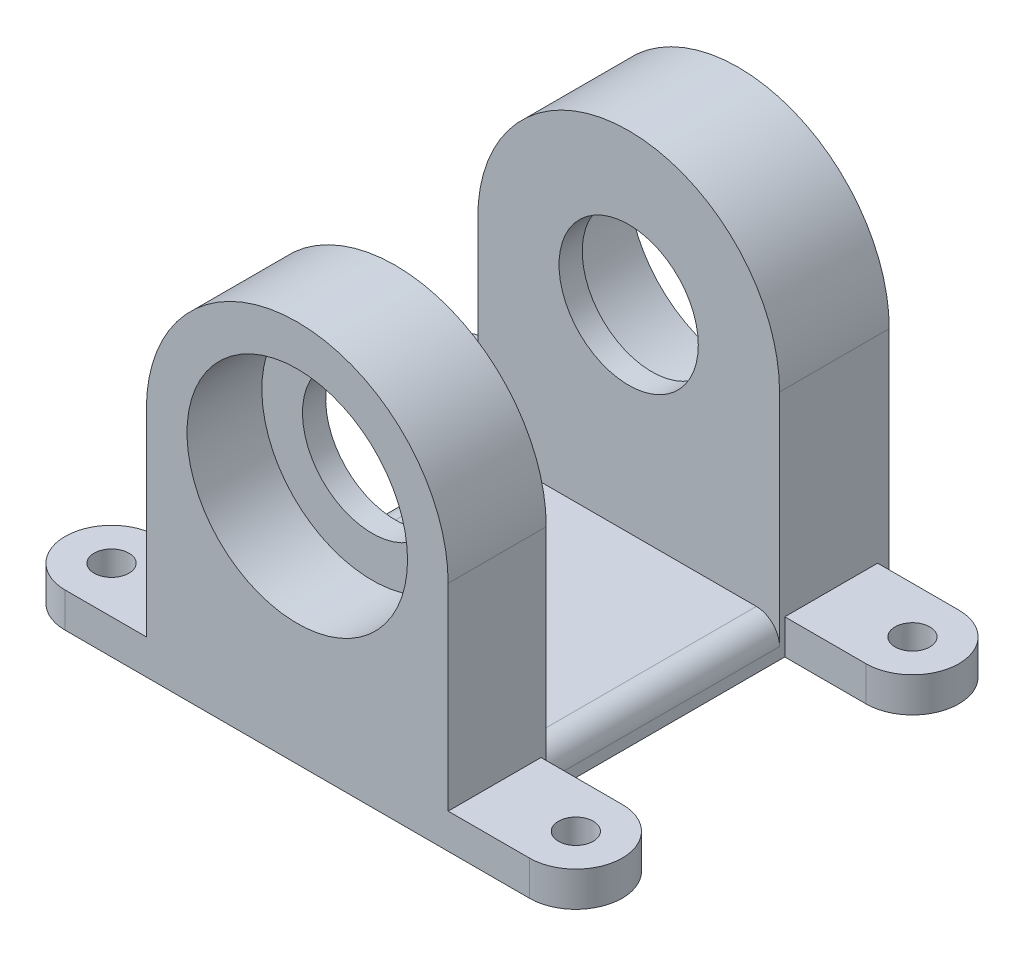
ISO-10303-21;
HEADER;
FILE_DESCRIPTION(('STEP AP214'),'2;1');
FILE_NAME('part.step','',(''),(''),'','','');
FILE_SCHEMA(('AUTOMOTIVE_DESIGN { 1 0 10303 214 1 1 1 1 }'));
ENDSEC;
DATA;
#1=APPLICATION_CONTEXT('core data for automotive mechanical design processes');
#2=APPLICATION_PROTOCOL_DEFINITION('international standard','automotive_design',2000,#1);
#3=PRODUCT_CONTEXT('',#1,'mechanical');
#4=PRODUCT('Part','Part','',(#3));
#5=PRODUCT_RELATED_PRODUCT_CATEGORY('part','',(#4));
#6=PRODUCT_DEFINITION_FORMATION('','',#4);
#7=PRODUCT_DEFINITION_CONTEXT('part definition',#1,'design');
#8=PRODUCT_DEFINITION('design','',#6,#7);
#9=PRODUCT_DEFINITION_SHAPE('','',#8);
#10=(LENGTH_UNIT() NAMED_UNIT(*) SI_UNIT(.MILLI.,.METRE.));
#11=(NAMED_UNIT(*) PLANE_ANGLE_UNIT() SI_UNIT($,.RADIAN.));
#12=(NAMED_UNIT(*) SI_UNIT($,.STERADIAN.) SOLID_ANGLE_UNIT());
#13=UNCERTAINTY_MEASURE_WITH_UNIT(LENGTH_MEASURE(1.E-05),#10,'distance_accuracy_value','');
#14=(GEOMETRIC_REPRESENTATION_CONTEXT(3) GLOBAL_UNCERTAINTY_ASSIGNED_CONTEXT((#13)) GLOBAL_UNIT_ASSIGNED_CONTEXT((#10,
#11,#12)) REPRESENTATION_CONTEXT('',''));
#15=CARTESIAN_POINT('',(0.,0.,0.));
#16=DIRECTION('',(0.,0.,1.));
#17=DIRECTION('',(1.,0.,0.));
#18=AXIS2_PLACEMENT_3D('',#15,#16,#17);
#19=CARTESIAN_POINT('',(0.,0.,0.));
#20=DIRECTION('',(0.,0.,1.));
#21=DIRECTION('',(1.,0.,0.));
#22=AXIS2_PLACEMENT_3D('',#19,#20,#21);
#23=PLANE('',#22);
#24=DIRECTION('',(0.,1.,0.));
#25=VECTOR('',#24,1.);
#26=CARTESIAN_POINT('',(-13.,0.,0.));
#27=LINE('',#26,#25);
#28=CARTESIAN_POINT('',(-13.,-20.,0.));
#29=VERTEX_POINT('',#28);
#30=CARTESIAN_POINT('',(-13.,-17.,0.));
#31=VERTEX_POINT('',#30);
#32=EDGE_CURVE('E474',#29,#31,#27,.T.);
#33=ORIENTED_EDGE('',*,*,#32,.F.);
#34=DIRECTION('',(1.,0.,0.));
#35=VECTOR('',#34,1.);
#36=CARTESIAN_POINT('',(-13.,-20.,0.));
#37=LINE('',#36,#35);
#38=CARTESIAN_POINT('',(-20.,-20.,0.));
#39=VERTEX_POINT('',#38);
#40=EDGE_CURVE('E387',#39,#29,#37,.T.);
#41=ORIENTED_EDGE('',*,*,#40,.F.);
#42=DIRECTION('',(0.,-1.,0.));
#43=VECTOR('',#42,1.);
#44=CARTESIAN_POINT('',(-20.,-17.,0.));
#45=LINE('',#44,#43);
#46=CARTESIAN_POINT('',(-20.,-17.,0.));
#47=VERTEX_POINT('',#46);
#48=EDGE_CURVE('E276',#47,#39,#45,.T.);
#49=ORIENTED_EDGE('',*,*,#48,.F.);
#50=DIRECTION('',(1.,0.,0.));
#51=VECTOR('',#50,1.);
#52=CARTESIAN_POINT('',(-13.,-17.,0.));
#53=LINE('',#52,#51);
#54=EDGE_CURVE('E271',#47,#31,#53,.T.);
#55=ORIENTED_EDGE('',*,*,#54,.T.);
#56=EDGE_LOOP('',(#33,#41,#49,#55));
#57=FACE_BOUND('',#56,.T.);
#58=ADVANCED_FACE('F41',(#57),#23,.F.);
#59=DIRECTION('',(0.,-1.,0.));
#60=VECTOR('',#59,1.);
#61=CARTESIAN_POINT('',(13.,-17.,0.));
#62=LINE('',#61,#60);
#63=CARTESIAN_POINT('',(13.,-17.,0.));
#64=VERTEX_POINT('',#63);
#65=CARTESIAN_POINT('',(13.,-20.,0.));
#66=VERTEX_POINT('',#65);
#67=EDGE_CURVE('E225',#64,#66,#62,.T.);
#68=ORIENTED_EDGE('',*,*,#67,.F.);
#69=DIRECTION('',(1.,0.,0.));
#70=VECTOR('',#69,1.);
#71=CARTESIAN_POINT('',(13.,-17.,0.));
#72=LINE('',#71,#70);
#73=CARTESIAN_POINT('',(20.,-17.,0.));
#74=VERTEX_POINT('',#73);
#75=EDGE_CURVE('E268',#64,#74,#72,.T.);
#76=ORIENTED_EDGE('',*,*,#75,.T.);
#77=DIRECTION('',(0.,-1.,0.));
#78=VECTOR('',#77,1.);
#79=CARTESIAN_POINT('',(20.,-17.,0.));
#80=LINE('',#79,#78);
#81=CARTESIAN_POINT('',(20.,-20.,0.));
#82=VERTEX_POINT('',#81);
#83=EDGE_CURVE('E243',#74,#82,#80,.T.);
#84=ORIENTED_EDGE('',*,*,#83,.T.);
#85=EDGE_CURVE('E384',#66,#82,#37,.T.);
#86=ORIENTED_EDGE('',*,*,#85,.F.);
#87=EDGE_LOOP('',(#68,#76,#84,#86));
#88=FACE_BOUND('',#87,.T.);
#89=ADVANCED_FACE('F473',(#88),#23,.F.);
#90=CARTESIAN_POINT('',(0.,0.,37.));
#91=DIRECTION('',(0.,0.,-1.));
#92=DIRECTION('',(-1.,0.,0.));
#93=AXIS2_PLACEMENT_3D('',#90,#91,#92);
#94=CYLINDRICAL_SURFACE('',#93,9.5);
#95=CARTESIAN_POINT('',(0.,0.,6.45));
#96=DIRECTION('',(0.,0.,1.));
#97=DIRECTION('',(1.,0.,0.));
#98=AXIS2_PLACEMENT_3D('',#95,#96,#97);
#99=CIRCLE('',#98,9.5);
#100=CARTESIAN_POINT('',(9.5,0.,6.45));
#101=VERTEX_POINT('',#100);
#102=EDGE_CURVE('E348',#101,#101,#99,.T.);
#103=ORIENTED_EDGE('',*,*,#102,.T.);
#104=EDGE_LOOP('',(#103));
#105=FACE_BOUND('',#104,.T.);
#106=CARTESIAN_POINT('',(0.,0.,-1.));
#107=DIRECTION('',(0.,0.,-1.));
#108=DIRECTION('',(-1.,0.,0.));
#109=AXIS2_PLACEMENT_3D('',#106,#107,#108);
#110=CIRCLE('',#109,9.5);
#111=CARTESIAN_POINT('',(-9.5,0.,-1.));
#112=VERTEX_POINT('',#111);
#113=EDGE_CURVE('E479',#112,#112,#110,.T.);
#114=ORIENTED_EDGE('',*,*,#113,.T.);
#115=EDGE_LOOP('',(#114));
#116=FACE_BOUND('',#115,.T.);
#117=ADVANCED_FACE('F482',(#105,#116),#94,.F.);
#118=CARTESIAN_POINT('',(0.,0.,37.));
#119=DIRECTION('',(0.,0.,1.));
#120=DIRECTION('',(1.,0.,0.));
#121=AXIS2_PLACEMENT_3D('',#118,#119,#120);
#122=CIRCLE('',#121,9.5);
#123=CARTESIAN_POINT('',(9.5,0.,37.));
#124=VERTEX_POINT('',#123);
#125=EDGE_CURVE('E379',#124,#124,#122,.T.);
#126=ORIENTED_EDGE('',*,*,#125,.T.);
#127=EDGE_LOOP('',(#126));
#128=FACE_BOUND('',#127,.T.);
#129=CARTESIAN_POINT('',(0.,0.,30.55));
#130=DIRECTION('',(0.,0.,-1.));
#131=DIRECTION('',(0.,1.,0.));
#132=AXIS2_PLACEMENT_3D('',#129,#130,#131);
#133=CIRCLE('',#132,9.5);
#134=CARTESIAN_POINT('',(0.,9.49999999999999,30.55));
#135=VERTEX_POINT('',#134);
#136=EDGE_CURVE('E356',#135,#135,#133,.T.);
#137=ORIENTED_EDGE('',*,*,#136,.T.);
#138=EDGE_LOOP('',(#137));
#139=FACE_BOUND('',#138,.T.);
#140=ADVANCED_FACE('F548',(#128,#139),#94,.F.);
#141=CARTESIAN_POINT('',(0.,0.,37.));
#142=DIRECTION('',(0.,0.,-1.));
#143=DIRECTION('',(-1.,0.,0.));
#144=AXIS2_PLACEMENT_3D('',#141,#142,#143);
#145=CYLINDRICAL_SURFACE('',#144,13.);
#146=DIRECTION('',(0.,0.,-1.));
#147=VECTOR('',#146,1.);
#148=CARTESIAN_POINT('',(13.,0.,37.));
#149=LINE('',#148,#147);
#150=CARTESIAN_POINT('',(13.,0.,37.));
#151=VERTEX_POINT('',#150);
#152=CARTESIAN_POINT('',(13.,0.,28.55));
#153=VERTEX_POINT('',#152);
#154=EDGE_CURVE('E400',#151,#153,#149,.T.);
#155=ORIENTED_EDGE('',*,*,#154,.T.);
#156=CARTESIAN_POINT('',(0.,0.,28.55));
#157=DIRECTION('',(0.,0.,1.));
#158=DIRECTION('',(0.,-1.,0.));
#159=AXIS2_PLACEMENT_3D('',#156,#157,#158);
#160=CIRCLE('',#159,13.);
#161=CARTESIAN_POINT('',(-13.,0.,28.55));
#162=VERTEX_POINT('',#161);
#163=EDGE_CURVE('E377',#153,#162,#160,.T.);
#164=ORIENTED_EDGE('',*,*,#163,.T.);
#165=DIRECTION('',(0.,0.,-1.));
#166=VECTOR('',#165,1.);
#167=CARTESIAN_POINT('',(-13.,0.,37.));
#168=LINE('',#167,#166);
#169=CARTESIAN_POINT('',(-13.,0.,37.));
#170=VERTEX_POINT('',#169);
#171=EDGE_CURVE('E406',#170,#162,#168,.T.);
#172=ORIENTED_EDGE('',*,*,#171,.F.);
#173=CARTESIAN_POINT('',(0.,0.,37.));
#174=DIRECTION('',(0.,0.,1.));
#175=DIRECTION('',(1.,0.,0.));
#176=AXIS2_PLACEMENT_3D('',#173,#174,#175);
#177=CIRCLE('',#176,13.);
#178=EDGE_CURVE('E381',#151,#170,#177,.T.);
#179=ORIENTED_EDGE('',*,*,#178,.F.);
#180=EDGE_LOOP('',(#155,#164,#172,#179));
#181=FACE_BOUND('',#180,.T.);
#182=ADVANCED_FACE('F443',(#181),#145,.T.);
#183=CARTESIAN_POINT('',(0.,0.,37.));
#184=DIRECTION('',(0.,0.,1.));
#185=DIRECTION('',(1.,0.,0.));
#186=AXIS2_PLACEMENT_3D('',#183,#184,#185);
#187=PLANE('',#186);
#188=ORIENTED_EDGE('',*,*,#178,.T.);
#189=DIRECTION('',(0.,-1.,0.));
#190=VECTOR('',#189,1.);
#191=CARTESIAN_POINT('',(-13.,0.,37.));
#192=LINE('',#191,#190);
#193=CARTESIAN_POINT('',(-13.,-17.,37.));
#194=VERTEX_POINT('',#193);
#195=EDGE_CURVE('E390',#170,#194,#192,.T.);
#196=ORIENTED_EDGE('',*,*,#195,.T.);
#197=DIRECTION('',(-1.,0.,0.));
#198=VECTOR('',#197,1.);
#199=CARTESIAN_POINT('',(-13.,-17.,37.));
#200=LINE('',#199,#198);
#201=CARTESIAN_POINT('',(-20.,-17.,37.));
#202=VERTEX_POINT('',#201);
#203=EDGE_CURVE('E312',#194,#202,#200,.T.);
#204=ORIENTED_EDGE('',*,*,#203,.T.);
#205=DIRECTION('',(0.,-1.,0.));
#206=VECTOR('',#205,1.);
#207=CARTESIAN_POINT('',(-20.,-17.,37.));
#208=LINE('',#207,#206);
#209=CARTESIAN_POINT('',(-20.,-20.,37.));
#210=VERTEX_POINT('',#209);
#211=EDGE_CURVE('E297',#202,#210,#208,.T.);
#212=ORIENTED_EDGE('',*,*,#211,.T.);
#213=DIRECTION('',(1.,0.,0.));
#214=VECTOR('',#213,1.);
#215=CARTESIAN_POINT('',(-13.,-20.,37.));
#216=LINE('',#215,#214);
#217=CARTESIAN_POINT('',(20.,-20.,37.));
#218=VERTEX_POINT('',#217);
#219=EDGE_CURVE('E394',#210,#218,#216,.T.);
#220=ORIENTED_EDGE('',*,*,#219,.T.);
#221=DIRECTION('',(0.,-1.,0.));
#222=VECTOR('',#221,1.);
#223=CARTESIAN_POINT('',(20.,-17.,37.));
#224=LINE('',#223,#222);
#225=CARTESIAN_POINT('',(20.,-17.,37.));
#226=VERTEX_POINT('',#225);
#227=EDGE_CURVE('E336',#226,#218,#224,.T.);
#228=ORIENTED_EDGE('',*,*,#227,.F.);
#229=DIRECTION('',(-1.,0.,0.));
#230=VECTOR('',#229,1.);
#231=CARTESIAN_POINT('',(13.,-17.,37.));
#232=LINE('',#231,#230);
#233=CARTESIAN_POINT('',(13.,-17.,37.));
#234=VERTEX_POINT('',#233);
#235=EDGE_CURVE('E327',#226,#234,#232,.T.);
#236=ORIENTED_EDGE('',*,*,#235,.T.);
#237=DIRECTION('',(0.,1.,0.));
#238=VECTOR('',#237,1.);
#239=CARTESIAN_POINT('',(13.,-20.,37.));
#240=LINE('',#239,#238);
#241=EDGE_CURVE('E395',#234,#151,#240,.T.);
#242=ORIENTED_EDGE('',*,*,#241,.T.);
#243=EDGE_LOOP('',(#188,#196,#204,#212,#220,#228,#236,#242));
#244=FACE_BOUND('',#243,.T.);
#245=ORIENTED_EDGE('',*,*,#125,.F.);
#246=EDGE_LOOP('',(#245));
#247=FACE_BOUND('',#246,.T.);
#248=ADVANCED_FACE('F449',(#244,#247),#187,.T.);
#249=CARTESIAN_POINT('',(-13.,0.,8.45));
#250=VERTEX_POINT('',#249);
#251=CARTESIAN_POINT('',(-13.,0.,-1.));
#252=VERTEX_POINT('',#251);
#253=EDGE_CURVE('E403',#250,#252,#168,.T.);
#254=ORIENTED_EDGE('',*,*,#253,.F.);
#255=CARTESIAN_POINT('',(0.,0.,8.45));
#256=DIRECTION('',(0.,0.,-1.));
#257=DIRECTION('',(-1.,0.,0.));
#258=AXIS2_PLACEMENT_3D('',#255,#256,#257);
#259=CIRCLE('',#258,13.);
#260=CARTESIAN_POINT('',(13.,0.,8.45));
#261=VERTEX_POINT('',#260);
#262=EDGE_CURVE('E372',#250,#261,#259,.T.);
#263=ORIENTED_EDGE('',*,*,#262,.T.);
#264=CARTESIAN_POINT('',(13.,0.,-1.));
#265=VERTEX_POINT('',#264);
#266=EDGE_CURVE('E392',#261,#265,#149,.T.);
#267=ORIENTED_EDGE('',*,*,#266,.T.);
#268=CARTESIAN_POINT('',(0.,0.,-1.));
#269=DIRECTION('',(0.,0.,-1.));
#270=DIRECTION('',(1.,0.,0.));
#271=AXIS2_PLACEMENT_3D('',#268,#269,#270);
#272=CIRCLE('',#271,13.);
#273=EDGE_CURVE('E223',#252,#265,#272,.T.);
#274=ORIENTED_EDGE('',*,*,#273,.F.);
#275=EDGE_LOOP('',(#254,#263,#267,#274));
#276=FACE_BOUND('',#275,.T.);
#277=ADVANCED_FACE('F515',(#276),#145,.T.);
#278=CARTESIAN_POINT('',(-13.,0.,37.));
#279=DIRECTION('',(1.,0.,0.));
#280=DIRECTION('',(0.,1.,0.));
#281=AXIS2_PLACEMENT_3D('',#278,#279,#280);
#282=PLANE('',#281);
#283=DIRECTION('',(0.,0.,-1.));
#284=VECTOR('',#283,1.);
#285=CARTESIAN_POINT('',(-13.,-19.,37.));
#286=LINE('',#285,#284);
#287=CARTESIAN_POINT('',(-13.,-19.,28.55));
#288=VERTEX_POINT('',#287);
#289=CARTESIAN_POINT('',(-13.,-19.,8.45));
#290=VERTEX_POINT('',#289);
#291=EDGE_CURVE('E408',#288,#290,#286,.T.);
#292=ORIENTED_EDGE('',*,*,#291,.T.);
#293=DIRECTION('',(0.,1.,0.));
#294=VECTOR('',#293,1.);
#295=CARTESIAN_POINT('',(-13.,-17.,8.45));
#296=LINE('',#295,#294);
#297=EDGE_CURVE('E361',#290,#250,#296,.T.);
#298=ORIENTED_EDGE('',*,*,#297,.T.);
#299=ORIENTED_EDGE('',*,*,#253,.T.);
#300=DIRECTION('',(0.,1.,0.));
#301=VECTOR('',#300,1.);
#302=CARTESIAN_POINT('',(-13.,0.,-1.));
#303=LINE('',#302,#301);
#304=CARTESIAN_POINT('',(-13.,-20.,-1.));
#305=VERTEX_POINT('',#304);
#306=EDGE_CURVE('E212',#305,#252,#303,.T.);
#307=ORIENTED_EDGE('',*,*,#306,.F.);
#308=DIRECTION('',(0.,0.,1.));
#309=VECTOR('',#308,1.);
#310=CARTESIAN_POINT('',(-13.,-20.,-1.));
#311=LINE('',#310,#309);
#312=EDGE_CURVE('E209',#305,#29,#311,.T.);
#313=ORIENTED_EDGE('',*,*,#312,.T.);
#314=ORIENTED_EDGE('',*,*,#32,.T.);
#315=DIRECTION('',(0.,0.,1.));
#316=VECTOR('',#315,1.);
#317=CARTESIAN_POINT('',(-13.,-17.,8.));
#318=LINE('',#317,#316);
#319=CARTESIAN_POINT('',(-13.,-17.,8.));
#320=VERTEX_POINT('',#319);
#321=EDGE_CURVE('E285',#31,#320,#318,.T.);
#322=ORIENTED_EDGE('',*,*,#321,.T.);
#323=DIRECTION('',(0.,-1.,0.));
#324=VECTOR('',#323,1.);
#325=CARTESIAN_POINT('',(-13.,-17.,8.));
#326=LINE('',#325,#324);
#327=CARTESIAN_POINT('',(-13.,-20.,8.));
#328=VERTEX_POINT('',#327);
#329=EDGE_CURVE('E269',#320,#328,#326,.T.);
#330=ORIENTED_EDGE('',*,*,#329,.T.);
#331=DIRECTION('',(0.,0.,-1.));
#332=VECTOR('',#331,1.);
#333=CARTESIAN_POINT('',(-13.,-20.,37.));
#334=LINE('',#333,#332);
#335=CARTESIAN_POINT('',(-13.,-20.,29.));
#336=VERTEX_POINT('',#335);
#337=EDGE_CURVE('E405',#336,#328,#334,.T.);
#338=ORIENTED_EDGE('',*,*,#337,.F.);
#339=DIRECTION('',(0.,-1.,0.));
#340=VECTOR('',#339,1.);
#341=CARTESIAN_POINT('',(-13.,-17.,29.));
#342=LINE('',#341,#340);
#343=CARTESIAN_POINT('',(-13.,-17.,29.));
#344=VERTEX_POINT('',#343);
#345=EDGE_CURVE('E298',#344,#336,#342,.T.);
#346=ORIENTED_EDGE('',*,*,#345,.F.);
#347=DIRECTION('',(0.,0.,1.));
#348=VECTOR('',#347,1.);
#349=CARTESIAN_POINT('',(-13.,-17.,29.));
#350=LINE('',#349,#348);
#351=EDGE_CURVE('E317',#344,#194,#350,.T.);
#352=ORIENTED_EDGE('',*,*,#351,.T.);
#353=ORIENTED_EDGE('',*,*,#195,.F.);
#354=ORIENTED_EDGE('',*,*,#171,.T.);
#355=DIRECTION('',(0.,-1.,0.));
#356=VECTOR('',#355,1.);
#357=CARTESIAN_POINT('',(-13.,13.,28.55));
#358=LINE('',#357,#356);
#359=EDGE_CURVE('E366',#162,#288,#358,.T.);
#360=ORIENTED_EDGE('',*,*,#359,.T.);
#361=EDGE_LOOP('',(#292,#298,#299,#307,#313,#314,#322,#330,#338,#346,#352,#353,#354,#360));
#362=FACE_BOUND('',#361,.T.);
#363=ADVANCED_FACE('F507',(#362),#282,.F.);
#364=CARTESIAN_POINT('',(-13.,-20.,37.));
#365=DIRECTION('',(0.,1.,0.));
#366=DIRECTION('',(0.,0.,1.));
#367=AXIS2_PLACEMENT_3D('',#364,#365,#366);
#368=PLANE('',#367);
#369=CARTESIAN_POINT('',(20.,-20.,33.));
#370=DIRECTION('',(0.,-1.,0.));
#371=DIRECTION('',(0.,0.,-1.));
#372=AXIS2_PLACEMENT_3D('',#369,#370,#371);
#373=CIRCLE('',#372,1.5);
#374=CARTESIAN_POINT('',(20.,-20.,31.5));
#375=VERTEX_POINT('',#374);
#376=EDGE_CURVE('E234',#375,#375,#373,.T.);
#377=ORIENTED_EDGE('',*,*,#376,.F.);
#378=EDGE_LOOP('',(#377));
#379=FACE_BOUND('',#378,.T.);
#380=CARTESIAN_POINT('',(-20.,-20.,4.));
#381=DIRECTION('',(0.,-1.,0.));
#382=DIRECTION('',(0.,0.,-1.));
#383=AXIS2_PLACEMENT_3D('',#380,#381,#382);
#384=CIRCLE('',#383,1.5);
#385=CARTESIAN_POINT('',(-20.,-20.,2.5));
#386=VERTEX_POINT('',#385);
#387=EDGE_CURVE('E230',#386,#386,#384,.T.);
#388=ORIENTED_EDGE('',*,*,#387,.F.);
#389=EDGE_LOOP('',(#388));
#390=FACE_BOUND('',#389,.T.);
#391=CARTESIAN_POINT('',(20.,-20.,4.));
#392=DIRECTION('',(0.,-1.,0.));
#393=DIRECTION('',(0.,0.,-1.));
#394=AXIS2_PLACEMENT_3D('',#391,#392,#393);
#395=CIRCLE('',#394,1.5);
#396=CARTESIAN_POINT('',(20.,-20.,2.5));
#397=VERTEX_POINT('',#396);
#398=EDGE_CURVE('E228',#397,#397,#395,.T.);
#399=ORIENTED_EDGE('',*,*,#398,.F.);
#400=EDGE_LOOP('',(#399));
#401=FACE_BOUND('',#400,.T.);
#402=CARTESIAN_POINT('',(-20.,-20.,33.));
#403=DIRECTION('',(0.,-1.,0.));
#404=DIRECTION('',(0.,0.,-1.));
#405=AXIS2_PLACEMENT_3D('',#402,#403,#404);
#406=CIRCLE('',#405,1.5);
#407=CARTESIAN_POINT('',(-20.,-20.,31.5));
#408=VERTEX_POINT('',#407);
#409=EDGE_CURVE('E240',#408,#408,#406,.T.);
#410=ORIENTED_EDGE('',*,*,#409,.F.);
#411=EDGE_LOOP('',(#410));
#412=FACE_BOUND('',#411,.T.);
#413=ORIENTED_EDGE('',*,*,#40,.T.);
#414=ORIENTED_EDGE('',*,*,#312,.F.);
#415=DIRECTION('',(-1.,0.,0.));
#416=VECTOR('',#415,1.);
#417=CARTESIAN_POINT('',(-13.,-20.,-1.));
#418=LINE('',#417,#416);
#419=CARTESIAN_POINT('',(13.,-20.,-1.));
#420=VERTEX_POINT('',#419);
#421=EDGE_CURVE('E205',#420,#305,#418,.T.);
#422=ORIENTED_EDGE('',*,*,#421,.F.);
#423=DIRECTION('',(0.,0.,1.));
#424=VECTOR('',#423,1.);
#425=CARTESIAN_POINT('',(13.,-20.,-1.));
#426=LINE('',#425,#424);
#427=EDGE_CURVE('E210',#420,#66,#426,.T.);
#428=ORIENTED_EDGE('',*,*,#427,.T.);
#429=ORIENTED_EDGE('',*,*,#85,.T.);
#430=CARTESIAN_POINT('',(20.,-20.,4.));
#431=DIRECTION('',(0.,-1.,0.));
#432=DIRECTION('',(0.,0.,-1.));
#433=AXIS2_PLACEMENT_3D('',#430,#431,#432);
#434=CIRCLE('',#433,4.);
#435=CARTESIAN_POINT('',(20.,-20.,8.));
#436=VERTEX_POINT('',#435);
#437=EDGE_CURVE('E256',#82,#436,#434,.T.);
#438=ORIENTED_EDGE('',*,*,#437,.T.);
#439=DIRECTION('',(-1.,0.,0.));
#440=VECTOR('',#439,1.);
#441=CARTESIAN_POINT('',(20.,-20.,8.));
#442=LINE('',#441,#440);
#443=CARTESIAN_POINT('',(13.,-20.,8.));
#444=VERTEX_POINT('',#443);
#445=EDGE_CURVE('E254',#436,#444,#442,.T.);
#446=ORIENTED_EDGE('',*,*,#445,.T.);
#447=DIRECTION('',(0.,0.,-1.));
#448=VECTOR('',#447,1.);
#449=CARTESIAN_POINT('',(13.,-20.,37.));
#450=LINE('',#449,#448);
#451=CARTESIAN_POINT('',(13.,-20.,29.));
#452=VERTEX_POINT('',#451);
#453=EDGE_CURVE('E399',#452,#444,#450,.T.);
#454=ORIENTED_EDGE('',*,*,#453,.F.);
#455=DIRECTION('',(1.,0.,0.));
#456=VECTOR('',#455,1.);
#457=CARTESIAN_POINT('',(20.,-20.,29.));
#458=LINE('',#457,#456);
#459=CARTESIAN_POINT('',(20.,-20.,29.));
#460=VERTEX_POINT('',#459);
#461=EDGE_CURVE('E259',#452,#460,#458,.T.);
#462=ORIENTED_EDGE('',*,*,#461,.T.);
#463=CARTESIAN_POINT('',(20.,-20.,33.));
#464=DIRECTION('',(0.,-1.,0.));
#465=DIRECTION('',(0.,0.,1.));
#466=AXIS2_PLACEMENT_3D('',#463,#464,#465);
#467=CIRCLE('',#466,4.);
#468=EDGE_CURVE('E323',#460,#218,#467,.T.);
#469=ORIENTED_EDGE('',*,*,#468,.T.);
#470=ORIENTED_EDGE('',*,*,#219,.F.);
#471=CARTESIAN_POINT('',(-20.,-20.,33.));
#472=DIRECTION('',(0.,-1.,0.));
#473=DIRECTION('',(0.,0.,-1.));
#474=AXIS2_PLACEMENT_3D('',#471,#472,#473);
#475=CIRCLE('',#474,3.99999999999999);
#476=CARTESIAN_POINT('',(-20.,-20.,29.));
#477=VERTEX_POINT('',#476);
#478=EDGE_CURVE('E306',#210,#477,#475,.T.);
#479=ORIENTED_EDGE('',*,*,#478,.T.);
#480=DIRECTION('',(1.,0.,0.));
#481=VECTOR('',#480,1.);
#482=CARTESIAN_POINT('',(-20.,-20.,29.));
#483=LINE('',#482,#481);
#484=EDGE_CURVE('E278',#477,#336,#483,.T.);
#485=ORIENTED_EDGE('',*,*,#484,.T.);
#486=ORIENTED_EDGE('',*,*,#337,.T.);
#487=DIRECTION('',(-1.,0.,0.));
#488=VECTOR('',#487,1.);
#489=CARTESIAN_POINT('',(-20.,-20.,7.99999999999999));
#490=LINE('',#489,#488);
#491=CARTESIAN_POINT('',(-20.,-20.,7.99999999999999));
#492=VERTEX_POINT('',#491);
#493=EDGE_CURVE('E255',#328,#492,#490,.T.);
#494=ORIENTED_EDGE('',*,*,#493,.T.);
#495=CARTESIAN_POINT('',(-20.,-20.,4.));
#496=DIRECTION('',(0.,-1.,0.));
#497=DIRECTION('',(0.,0.,1.));
#498=AXIS2_PLACEMENT_3D('',#495,#496,#497);
#499=CIRCLE('',#498,4.);
#500=EDGE_CURVE('E279',#492,#39,#499,.T.);
#501=ORIENTED_EDGE('',*,*,#500,.T.);
#502=EDGE_LOOP('',(#413,#414,#422,#428,#429,#438,#446,#454,#462,#469,#470,#479,#485,#486,#494,#501));
#503=FACE_BOUND('',#502,.T.);
#504=ADVANCED_FACE('F204',(#379,#390,#401,#412,#503),#368,.F.);
#505=CARTESIAN_POINT('',(13.,-20.,37.));
#506=DIRECTION('',(-1.,0.,0.));
#507=DIRECTION('',(0.,-1.,0.));
#508=AXIS2_PLACEMENT_3D('',#505,#506,#507);
#509=PLANE('',#508);
#510=DIRECTION('',(0.,1.,0.));
#511=VECTOR('',#510,1.);
#512=CARTESIAN_POINT('',(13.,-17.,8.45));
#513=LINE('',#512,#511);
#514=CARTESIAN_POINT('',(13.,-19.,8.45));
#515=VERTEX_POINT('',#514);
#516=EDGE_CURVE('E57',#515,#261,#513,.T.);
#517=ORIENTED_EDGE('',*,*,#516,.F.);
#518=DIRECTION('',(0.,0.,-1.));
#519=VECTOR('',#518,1.);
#520=CARTESIAN_POINT('',(13.,-19.,37.));
#521=LINE('',#520,#519);
#522=CARTESIAN_POINT('',(13.,-19.,28.55));
#523=VERTEX_POINT('',#522);
#524=EDGE_CURVE('E430',#515,#523,#521,.F.);
#525=ORIENTED_EDGE('',*,*,#524,.T.);
#526=DIRECTION('',(0.,-1.,0.));
#527=VECTOR('',#526,1.);
#528=CARTESIAN_POINT('',(13.,13.,28.55));
#529=LINE('',#528,#527);
#530=EDGE_CURVE('E62',#153,#523,#529,.T.);
#531=ORIENTED_EDGE('',*,*,#530,.F.);
#532=ORIENTED_EDGE('',*,*,#154,.F.);
#533=ORIENTED_EDGE('',*,*,#241,.F.);
#534=DIRECTION('',(0.,0.,-1.));
#535=VECTOR('',#534,1.);
#536=CARTESIAN_POINT('',(13.,-17.,29.));
#537=LINE('',#536,#535);
#538=CARTESIAN_POINT('',(13.,-17.,29.));
#539=VERTEX_POINT('',#538);
#540=EDGE_CURVE('E321',#234,#539,#537,.T.);
#541=ORIENTED_EDGE('',*,*,#540,.T.);
#542=DIRECTION('',(0.,-1.,0.));
#543=VECTOR('',#542,1.);
#544=CARTESIAN_POINT('',(13.,-17.,29.));
#545=LINE('',#544,#543);
#546=EDGE_CURVE('E331',#539,#452,#545,.T.);
#547=ORIENTED_EDGE('',*,*,#546,.T.);
#548=ORIENTED_EDGE('',*,*,#453,.T.);
#549=DIRECTION('',(0.,-1.,0.));
#550=VECTOR('',#549,1.);
#551=CARTESIAN_POINT('',(13.,-17.,8.));
#552=LINE('',#551,#550);
#553=CARTESIAN_POINT('',(13.,-17.,8.));
#554=VERTEX_POINT('',#553);
#555=EDGE_CURVE('E248',#554,#444,#552,.T.);
#556=ORIENTED_EDGE('',*,*,#555,.F.);
#557=DIRECTION('',(0.,0.,-1.));
#558=VECTOR('',#557,1.);
#559=CARTESIAN_POINT('',(13.,-17.,8.));
#560=LINE('',#559,#558);
#561=EDGE_CURVE('E260',#554,#64,#560,.T.);
#562=ORIENTED_EDGE('',*,*,#561,.T.);
#563=ORIENTED_EDGE('',*,*,#67,.T.);
#564=ORIENTED_EDGE('',*,*,#427,.F.);
#565=DIRECTION('',(0.,-1.,0.));
#566=VECTOR('',#565,1.);
#567=CARTESIAN_POINT('',(13.,-20.,-1.));
#568=LINE('',#567,#566);
#569=EDGE_CURVE('E213',#265,#420,#568,.T.);
#570=ORIENTED_EDGE('',*,*,#569,.F.);
#571=ORIENTED_EDGE('',*,*,#266,.F.);
#572=EDGE_LOOP('',(#517,#525,#531,#532,#533,#541,#547,#548,#556,#562,#563,#564,#570,#571));
#573=FACE_BOUND('',#572,.T.);
#574=ADVANCED_FACE('F222',(#573),#509,.F.);
#575=CARTESIAN_POINT('',(-13.,13.,28.55));
#576=DIRECTION('',(0.,0.,1.));
#577=DIRECTION('',(0.,-1.,0.));
#578=AXIS2_PLACEMENT_3D('',#575,#576,#577);
#579=PLANE('',#578);
#580=ORIENTED_EDGE('',*,*,#530,.T.);
#581=CARTESIAN_POINT('',(11.,-19.,28.55));
#582=DIRECTION('',(0.,0.,1.));
#583=DIRECTION('',(0.,-1.,0.));
#584=AXIS2_PLACEMENT_3D('',#581,#582,#583);
#585=CIRCLE('',#584,2.);
#586=CARTESIAN_POINT('',(11.,-17.,28.55));
#587=VERTEX_POINT('',#586);
#588=EDGE_CURVE('E11',#523,#587,#585,.T.);
#589=ORIENTED_EDGE('',*,*,#588,.T.);
#590=DIRECTION('',(1.,0.,0.));
#591=VECTOR('',#590,1.);
#592=CARTESIAN_POINT('',(-13.,-17.,28.55));
#593=LINE('',#592,#591);
#594=CARTESIAN_POINT('',(-11.,-17.,28.55));
#595=VERTEX_POINT('',#594);
#596=EDGE_CURVE('E371',#595,#587,#593,.T.);
#597=ORIENTED_EDGE('',*,*,#596,.F.);
#598=CARTESIAN_POINT('',(-11.,-19.,28.55));
#599=DIRECTION('',(0.,0.,1.));
#600=DIRECTION('',(0.,-1.,0.));
#601=AXIS2_PLACEMENT_3D('',#598,#599,#600);
#602=CIRCLE('',#601,2.);
#603=EDGE_CURVE('E431',#595,#288,#602,.T.);
#604=ORIENTED_EDGE('',*,*,#603,.T.);
#605=ORIENTED_EDGE('',*,*,#359,.F.);
#606=ORIENTED_EDGE('',*,*,#163,.F.);
#607=EDGE_LOOP('',(#580,#589,#597,#604,#605,#606));
#608=FACE_BOUND('',#607,.T.);
#609=CARTESIAN_POINT('',(0.,0.,28.55));
#610=DIRECTION('',(0.,0.,-1.));
#611=DIRECTION('',(0.,1.,0.));
#612=AXIS2_PLACEMENT_3D('',#609,#610,#611);
#613=CIRCLE('',#612,6.);
#614=CARTESIAN_POINT('',(0.,5.99999999999999,28.55));
#615=VERTEX_POINT('',#614);
#616=EDGE_CURVE('E352',#615,#615,#613,.T.);
#617=ORIENTED_EDGE('',*,*,#616,.F.);
#618=EDGE_LOOP('',(#617));
#619=FACE_BOUND('',#618,.T.);
#620=ADVANCED_FACE('F504',(#608,#619),#579,.F.);
#621=CARTESIAN_POINT('',(-13.,-17.,8.45));
#622=DIRECTION('',(0.,0.,-1.));
#623=DIRECTION('',(-1.,0.,0.));
#624=AXIS2_PLACEMENT_3D('',#621,#622,#623);
#625=PLANE('',#624);
#626=ORIENTED_EDGE('',*,*,#297,.F.);
#627=CARTESIAN_POINT('',(-11.,-19.,8.45));
#628=DIRECTION('',(0.,0.,-1.));
#629=DIRECTION('',(-1.,0.,0.));
#630=AXIS2_PLACEMENT_3D('',#627,#628,#629);
#631=CIRCLE('',#630,2.);
#632=CARTESIAN_POINT('',(-11.,-17.,8.45));
#633=VERTEX_POINT('',#632);
#634=EDGE_CURVE('E429',#290,#633,#631,.T.);
#635=ORIENTED_EDGE('',*,*,#634,.T.);
#636=DIRECTION('',(1.,0.,0.));
#637=VECTOR('',#636,1.);
#638=CARTESIAN_POINT('',(-13.,-17.,8.45));
#639=LINE('',#638,#637);
#640=CARTESIAN_POINT('',(11.,-17.,8.45));
#641=VERTEX_POINT('',#640);
#642=EDGE_CURVE('E368',#633,#641,#639,.T.);
#643=ORIENTED_EDGE('',*,*,#642,.T.);
#644=CARTESIAN_POINT('',(11.,-19.,8.45));
#645=DIRECTION('',(0.,0.,-1.));
#646=DIRECTION('',(-1.,0.,0.));
#647=AXIS2_PLACEMENT_3D('',#644,#645,#646);
#648=CIRCLE('',#647,2.);
#649=EDGE_CURVE('E47',#641,#515,#648,.T.);
#650=ORIENTED_EDGE('',*,*,#649,.T.);
#651=ORIENTED_EDGE('',*,*,#516,.T.);
#652=ORIENTED_EDGE('',*,*,#262,.F.);
#653=EDGE_LOOP('',(#626,#635,#643,#650,#651,#652));
#654=FACE_BOUND('',#653,.T.);
#655=CARTESIAN_POINT('',(0.,0.,8.45));
#656=DIRECTION('',(0.,0.,1.));
#657=DIRECTION('',(1.,0.,0.));
#658=AXIS2_PLACEMENT_3D('',#655,#656,#657);
#659=CIRCLE('',#658,6.);
#660=CARTESIAN_POINT('',(6.,0.,8.45));
#661=VERTEX_POINT('',#660);
#662=EDGE_CURVE('E341',#661,#661,#659,.T.);
#663=ORIENTED_EDGE('',*,*,#662,.F.);
#664=EDGE_LOOP('',(#663));
#665=FACE_BOUND('',#664,.T.);
#666=ADVANCED_FACE('F434',(#654,#665),#625,.F.);
#667=CARTESIAN_POINT('',(-13.,-17.,28.55));
#668=DIRECTION('',(0.,-1.,0.));
#669=DIRECTION('',(1.,0.,0.));
#670=AXIS2_PLACEMENT_3D('',#667,#668,#669);
#671=PLANE('',#670);
#672=ORIENTED_EDGE('',*,*,#642,.F.);
#673=DIRECTION('',(0.,0.,-1.));
#674=VECTOR('',#673,1.);
#675=CARTESIAN_POINT('',(-11.,-17.,28.55));
#676=LINE('',#675,#674);
#677=EDGE_CURVE('E424',#633,#595,#676,.F.);
#678=ORIENTED_EDGE('',*,*,#677,.T.);
#679=ORIENTED_EDGE('',*,*,#596,.T.);
#680=DIRECTION('',(0.,0.,-1.));
#681=VECTOR('',#680,1.);
#682=CARTESIAN_POINT('',(11.,-17.,28.55));
#683=LINE('',#682,#681);
#684=EDGE_CURVE('E422',#587,#641,#683,.T.);
#685=ORIENTED_EDGE('',*,*,#684,.T.);
#686=EDGE_LOOP('',(#672,#678,#679,#685));
#687=FACE_BOUND('',#686,.T.);
#688=ADVANCED_FACE('F531',(#687),#671,.F.);
#689=CARTESIAN_POINT('',(0.,0.,30.55));
#690=DIRECTION('',(0.,0.,-1.));
#691=DIRECTION('',(0.,1.,0.));
#692=AXIS2_PLACEMENT_3D('',#689,#690,#691);
#693=PLANE('',#692);
#694=CARTESIAN_POINT('',(0.,0.,30.55));
#695=DIRECTION('',(0.,0.,-1.));
#696=DIRECTION('',(0.,1.,0.));
#697=AXIS2_PLACEMENT_3D('',#694,#695,#696);
#698=CIRCLE('',#697,6.);
#699=CARTESIAN_POINT('',(0.,5.99999999999999,30.55));
#700=VERTEX_POINT('',#699);
#701=EDGE_CURVE('E354',#700,#700,#698,.T.);
#702=ORIENTED_EDGE('',*,*,#701,.T.);
#703=EDGE_LOOP('',(#702));
#704=FACE_BOUND('',#703,.T.);
#705=ORIENTED_EDGE('',*,*,#136,.F.);
#706=EDGE_LOOP('',(#705));
#707=FACE_BOUND('',#706,.T.);
#708=ADVANCED_FACE('F534',(#704,#707),#693,.F.);
#709=CARTESIAN_POINT('',(0.,0.,30.55));
#710=DIRECTION('',(0.,0.,-1.));
#711=DIRECTION('',(0.,1.,0.));
#712=AXIS2_PLACEMENT_3D('',#709,#710,#711);
#713=CYLINDRICAL_SURFACE('',#712,6.);
#714=ORIENTED_EDGE('',*,*,#701,.F.);
#715=EDGE_LOOP('',(#714));
#716=FACE_BOUND('',#715,.T.);
#717=ORIENTED_EDGE('',*,*,#616,.T.);
#718=EDGE_LOOP('',(#717));
#719=FACE_BOUND('',#718,.T.);
#720=ADVANCED_FACE('F539',(#716,#719),#713,.F.);
#721=CARTESIAN_POINT('',(0.,0.,6.45));
#722=DIRECTION('',(0.,0.,1.));
#723=DIRECTION('',(1.,0.,0.));
#724=AXIS2_PLACEMENT_3D('',#721,#722,#723);
#725=PLANE('',#724);
#726=CARTESIAN_POINT('',(0.,0.,6.45));
#727=DIRECTION('',(0.,0.,1.));
#728=DIRECTION('',(1.,0.,0.));
#729=AXIS2_PLACEMENT_3D('',#726,#727,#728);
#730=CIRCLE('',#729,6.);
#731=CARTESIAN_POINT('',(6.,0.,6.45));
#732=VERTEX_POINT('',#731);
#733=EDGE_CURVE('E349',#732,#732,#730,.T.);
#734=ORIENTED_EDGE('',*,*,#733,.T.);
#735=EDGE_LOOP('',(#734));
#736=FACE_BOUND('',#735,.T.);
#737=ORIENTED_EDGE('',*,*,#102,.F.);
#738=EDGE_LOOP('',(#737));
#739=FACE_BOUND('',#738,.T.);
#740=ADVANCED_FACE('F555',(#736,#739),#725,.F.);
#741=CARTESIAN_POINT('',(0.,0.,6.45));
#742=DIRECTION('',(0.,0.,1.));
#743=DIRECTION('',(1.,0.,0.));
#744=AXIS2_PLACEMENT_3D('',#741,#742,#743);
#745=CYLINDRICAL_SURFACE('',#744,6.);
#746=ORIENTED_EDGE('',*,*,#733,.F.);
#747=EDGE_LOOP('',(#746));
#748=FACE_BOUND('',#747,.T.);
#749=ORIENTED_EDGE('',*,*,#662,.T.);
#750=EDGE_LOOP('',(#749));
#751=FACE_BOUND('',#750,.T.);
#752=ADVANCED_FACE('F558',(#748,#751),#745,.F.);
#753=CARTESIAN_POINT('',(20.,-17.,33.));
#754=DIRECTION('',(0.,-1.,0.));
#755=DIRECTION('',(0.,0.,-1.));
#756=AXIS2_PLACEMENT_3D('',#753,#754,#755);
#757=CYLINDRICAL_SURFACE('',#756,4.);
#758=ORIENTED_EDGE('',*,*,#468,.F.);
#759=DIRECTION('',(0.,-1.,0.));
#760=VECTOR('',#759,1.);
#761=CARTESIAN_POINT('',(20.,-17.,29.));
#762=LINE('',#761,#760);
#763=CARTESIAN_POINT('',(20.,-17.,29.));
#764=VERTEX_POINT('',#763);
#765=EDGE_CURVE('E345',#764,#460,#762,.T.);
#766=ORIENTED_EDGE('',*,*,#765,.F.);
#767=CARTESIAN_POINT('',(20.,-17.,33.));
#768=DIRECTION('',(0.,-1.,0.));
#769=DIRECTION('',(0.,0.,1.));
#770=AXIS2_PLACEMENT_3D('',#767,#768,#769);
#771=CIRCLE('',#770,4.);
#772=EDGE_CURVE('E326',#764,#226,#771,.T.);
#773=ORIENTED_EDGE('',*,*,#772,.T.);
#774=ORIENTED_EDGE('',*,*,#227,.T.);
#775=EDGE_LOOP('',(#758,#766,#773,#774));
#776=FACE_BOUND('',#775,.T.);
#777=ADVANCED_FACE('F563',(#776),#757,.T.);
#778=CARTESIAN_POINT('',(20.,-17.,29.));
#779=DIRECTION('',(0.,0.,-1.));
#780=DIRECTION('',(-1.,0.,0.));
#781=AXIS2_PLACEMENT_3D('',#778,#779,#780);
#782=PLANE('',#781);
#783=ORIENTED_EDGE('',*,*,#461,.F.);
#784=ORIENTED_EDGE('',*,*,#546,.F.);
#785=DIRECTION('',(1.,0.,0.));
#786=VECTOR('',#785,1.);
#787=CARTESIAN_POINT('',(20.,-17.,29.));
#788=LINE('',#787,#786);
#789=EDGE_CURVE('E322',#539,#764,#788,.T.);
#790=ORIENTED_EDGE('',*,*,#789,.T.);
#791=ORIENTED_EDGE('',*,*,#765,.T.);
#792=EDGE_LOOP('',(#783,#784,#790,#791));
#793=FACE_BOUND('',#792,.T.);
#794=ADVANCED_FACE('F458',(#793),#782,.T.);
#795=CARTESIAN_POINT('',(20.,-17.,33.));
#796=DIRECTION('',(0.,1.,0.));
#797=DIRECTION('',(0.,0.,1.));
#798=AXIS2_PLACEMENT_3D('',#795,#796,#797);
#799=PLANE('',#798);
#800=CARTESIAN_POINT('',(20.,-17.,33.));
#801=DIRECTION('',(0.,1.,0.));
#802=DIRECTION('',(0.,0.,1.));
#803=AXIS2_PLACEMENT_3D('',#800,#801,#802);
#804=CIRCLE('',#803,1.5);
#805=CARTESIAN_POINT('',(20.,-17.,34.5));
#806=VERTEX_POINT('',#805);
#807=EDGE_CURVE('E304',#806,#806,#804,.T.);
#808=ORIENTED_EDGE('',*,*,#807,.F.);
#809=EDGE_LOOP('',(#808));
#810=FACE_BOUND('',#809,.T.);
#811=ORIENTED_EDGE('',*,*,#540,.F.);
#812=ORIENTED_EDGE('',*,*,#235,.F.);
#813=ORIENTED_EDGE('',*,*,#772,.F.);
#814=ORIENTED_EDGE('',*,*,#789,.F.);
#815=EDGE_LOOP('',(#811,#812,#813,#814));
#816=FACE_BOUND('',#815,.T.);
#817=ADVANCED_FACE('F454',(#810,#816),#799,.T.);
#818=CARTESIAN_POINT('',(20.,-17.,8.));
#819=DIRECTION('',(0.,0.,1.));
#820=DIRECTION('',(1.,0.,0.));
#821=AXIS2_PLACEMENT_3D('',#818,#819,#820);
#822=PLANE('',#821);
#823=ORIENTED_EDGE('',*,*,#445,.F.);
#824=DIRECTION('',(0.,-1.,0.));
#825=VECTOR('',#824,1.);
#826=CARTESIAN_POINT('',(20.,-17.,8.));
#827=LINE('',#826,#825);
#828=CARTESIAN_POINT('',(20.,-17.,8.));
#829=VERTEX_POINT('',#828);
#830=EDGE_CURVE('E250',#829,#436,#827,.T.);
#831=ORIENTED_EDGE('',*,*,#830,.F.);
#832=DIRECTION('',(-1.,0.,0.));
#833=VECTOR('',#832,1.);
#834=CARTESIAN_POINT('',(20.,-17.,8.));
#835=LINE('',#834,#833);
#836=EDGE_CURVE('E246',#829,#554,#835,.T.);
#837=ORIENTED_EDGE('',*,*,#836,.T.);
#838=ORIENTED_EDGE('',*,*,#555,.T.);
#839=EDGE_LOOP('',(#823,#831,#837,#838));
#840=FACE_BOUND('',#839,.T.);
#841=ADVANCED_FACE('F462',(#840),#822,.T.);
#842=CARTESIAN_POINT('',(20.,-17.,4.));
#843=DIRECTION('',(0.,-1.,0.));
#844=DIRECTION('',(0.,0.,-1.));
#845=AXIS2_PLACEMENT_3D('',#842,#843,#844);
#846=CYLINDRICAL_SURFACE('',#845,4.);
#847=ORIENTED_EDGE('',*,*,#437,.F.);
#848=ORIENTED_EDGE('',*,*,#83,.F.);
#849=CARTESIAN_POINT('',(20.,-17.,4.));
#850=DIRECTION('',(0.,-1.,0.));
#851=DIRECTION('',(0.,0.,-1.));
#852=AXIS2_PLACEMENT_3D('',#849,#850,#851);
#853=CIRCLE('',#852,4.);
#854=EDGE_CURVE('E265',#74,#829,#853,.T.);
#855=ORIENTED_EDGE('',*,*,#854,.T.);
#856=ORIENTED_EDGE('',*,*,#830,.T.);
#857=EDGE_LOOP('',(#847,#848,#855,#856));
#858=FACE_BOUND('',#857,.T.);
#859=ADVANCED_FACE('F466',(#858),#846,.T.);
#860=CARTESIAN_POINT('',(20.,-17.,4.));
#861=DIRECTION('',(0.,-1.,0.));
#862=DIRECTION('',(0.,0.,-1.));
#863=AXIS2_PLACEMENT_3D('',#860,#861,#862);
#864=PLANE('',#863);
#865=CARTESIAN_POINT('',(20.,-17.,4.));
#866=DIRECTION('',(0.,-1.,0.));
#867=DIRECTION('',(0.,0.,-1.));
#868=AXIS2_PLACEMENT_3D('',#865,#866,#867);
#869=CIRCLE('',#868,1.5);
#870=CARTESIAN_POINT('',(20.,-17.,2.5));
#871=VERTEX_POINT('',#870);
#872=EDGE_CURVE('E412',#871,#871,#869,.T.);
#873=ORIENTED_EDGE('',*,*,#872,.T.);
#874=EDGE_LOOP('',(#873));
#875=FACE_BOUND('',#874,.T.);
#876=ORIENTED_EDGE('',*,*,#561,.F.);
#877=ORIENTED_EDGE('',*,*,#836,.F.);
#878=ORIENTED_EDGE('',*,*,#854,.F.);
#879=ORIENTED_EDGE('',*,*,#75,.F.);
#880=EDGE_LOOP('',(#876,#877,#878,#879));
#881=FACE_BOUND('',#880,.T.);
#882=ADVANCED_FACE('F475',(#875,#881),#864,.F.);
#883=CARTESIAN_POINT('',(-20.,-17.,4.));
#884=DIRECTION('',(0.,-1.,0.));
#885=DIRECTION('',(0.,0.,-1.));
#886=AXIS2_PLACEMENT_3D('',#883,#884,#885);
#887=CYLINDRICAL_SURFACE('',#886,4.);
#888=ORIENTED_EDGE('',*,*,#500,.F.);
#889=DIRECTION('',(0.,-1.,0.));
#890=VECTOR('',#889,1.);
#891=CARTESIAN_POINT('',(-20.,-17.,7.99999999999999));
#892=LINE('',#891,#890);
#893=CARTESIAN_POINT('',(-20.,-17.,7.99999999999999));
#894=VERTEX_POINT('',#893);
#895=EDGE_CURVE('E274',#894,#492,#892,.T.);
#896=ORIENTED_EDGE('',*,*,#895,.F.);
#897=CARTESIAN_POINT('',(-20.,-17.,4.));
#898=DIRECTION('',(0.,-1.,0.));
#899=DIRECTION('',(0.,0.,1.));
#900=AXIS2_PLACEMENT_3D('',#897,#898,#899);
#901=CIRCLE('',#900,4.);
#902=EDGE_CURVE('E286',#894,#47,#901,.T.);
#903=ORIENTED_EDGE('',*,*,#902,.T.);
#904=ORIENTED_EDGE('',*,*,#48,.T.);
#905=EDGE_LOOP('',(#888,#896,#903,#904));
#906=FACE_BOUND('',#905,.T.);
#907=ADVANCED_FACE('F689',(#906),#887,.T.);
#908=CARTESIAN_POINT('',(-20.,-17.,7.99999999999999));
#909=DIRECTION('',(0.,0.,1.));
#910=DIRECTION('',(1.,0.,0.));
#911=AXIS2_PLACEMENT_3D('',#908,#909,#910);
#912=PLANE('',#911);
#913=ORIENTED_EDGE('',*,*,#493,.F.);
#914=ORIENTED_EDGE('',*,*,#329,.F.);
#915=DIRECTION('',(-1.,0.,0.));
#916=VECTOR('',#915,1.);
#917=CARTESIAN_POINT('',(-20.,-17.,7.99999999999999));
#918=LINE('',#917,#916);
#919=EDGE_CURVE('E293',#320,#894,#918,.T.);
#920=ORIENTED_EDGE('',*,*,#919,.T.);
#921=ORIENTED_EDGE('',*,*,#895,.T.);
#922=EDGE_LOOP('',(#913,#914,#920,#921));
#923=FACE_BOUND('',#922,.T.);
#924=ADVANCED_FACE('F698',(#923),#912,.T.);
#925=CARTESIAN_POINT('',(-20.,-17.,4.));
#926=DIRECTION('',(0.,1.,0.));
#927=DIRECTION('',(0.,0.,1.));
#928=AXIS2_PLACEMENT_3D('',#925,#926,#927);
#929=PLANE('',#928);
#930=CARTESIAN_POINT('',(-20.,-17.,4.));
#931=DIRECTION('',(0.,1.,0.));
#932=DIRECTION('',(0.,0.,1.));
#933=AXIS2_PLACEMENT_3D('',#930,#931,#932);
#934=CIRCLE('',#933,1.5);
#935=CARTESIAN_POINT('',(-20.,-17.,5.5));
#936=VERTEX_POINT('',#935);
#937=EDGE_CURVE('E411',#936,#936,#934,.T.);
#938=ORIENTED_EDGE('',*,*,#937,.F.);
#939=EDGE_LOOP('',(#938));
#940=FACE_BOUND('',#939,.T.);
#941=ORIENTED_EDGE('',*,*,#321,.F.);
#942=ORIENTED_EDGE('',*,*,#54,.F.);
#943=ORIENTED_EDGE('',*,*,#902,.F.);
#944=ORIENTED_EDGE('',*,*,#919,.F.);
#945=EDGE_LOOP('',(#941,#942,#943,#944));
#946=FACE_BOUND('',#945,.T.);
#947=ADVANCED_FACE('F709',(#940,#946),#929,.T.);
#948=CARTESIAN_POINT('',(-20.,-17.,29.));
#949=DIRECTION('',(0.,0.,-1.));
#950=DIRECTION('',(-1.,0.,0.));
#951=AXIS2_PLACEMENT_3D('',#948,#949,#950);
#952=PLANE('',#951);
#953=ORIENTED_EDGE('',*,*,#484,.F.);
#954=DIRECTION('',(0.,-1.,0.));
#955=VECTOR('',#954,1.);
#956=CARTESIAN_POINT('',(-20.,-17.,29.));
#957=LINE('',#956,#955);
#958=CARTESIAN_POINT('',(-20.,-17.,29.));
#959=VERTEX_POINT('',#958);
#960=EDGE_CURVE('E303',#959,#477,#957,.T.);
#961=ORIENTED_EDGE('',*,*,#960,.F.);
#962=DIRECTION('',(1.,0.,0.));
#963=VECTOR('',#962,1.);
#964=CARTESIAN_POINT('',(-20.,-17.,29.));
#965=LINE('',#964,#963);
#966=EDGE_CURVE('E307',#959,#344,#965,.T.);
#967=ORIENTED_EDGE('',*,*,#966,.T.);
#968=ORIENTED_EDGE('',*,*,#345,.T.);
#969=EDGE_LOOP('',(#953,#961,#967,#968));
#970=FACE_BOUND('',#969,.T.);
#971=ADVANCED_FACE('F720',(#970),#952,.T.);
#972=CARTESIAN_POINT('',(-20.,-17.,33.));
#973=DIRECTION('',(0.,-1.,0.));
#974=DIRECTION('',(0.,0.,-1.));
#975=AXIS2_PLACEMENT_3D('',#972,#973,#974);
#976=CYLINDRICAL_SURFACE('',#975,3.99999999999999);
#977=ORIENTED_EDGE('',*,*,#478,.F.);
#978=ORIENTED_EDGE('',*,*,#211,.F.);
#979=CARTESIAN_POINT('',(-20.,-17.,33.));
#980=DIRECTION('',(0.,-1.,0.));
#981=DIRECTION('',(0.,0.,-1.));
#982=AXIS2_PLACEMENT_3D('',#979,#980,#981);
#983=CIRCLE('',#982,3.99999999999999);
#984=EDGE_CURVE('E299',#202,#959,#983,.T.);
#985=ORIENTED_EDGE('',*,*,#984,.T.);
#986=ORIENTED_EDGE('',*,*,#960,.T.);
#987=EDGE_LOOP('',(#977,#978,#985,#986));
#988=FACE_BOUND('',#987,.T.);
#989=ADVANCED_FACE('F730',(#988),#976,.T.);
#990=CARTESIAN_POINT('',(-20.,-17.,33.));
#991=DIRECTION('',(0.,-1.,0.));
#992=DIRECTION('',(0.,0.,-1.));
#993=AXIS2_PLACEMENT_3D('',#990,#991,#992);
#994=PLANE('',#993);
#995=CARTESIAN_POINT('',(-20.,-17.,33.));
#996=DIRECTION('',(0.,-1.,0.));
#997=DIRECTION('',(0.,0.,-1.));
#998=AXIS2_PLACEMENT_3D('',#995,#996,#997);
#999=CIRCLE('',#998,1.5);
#1000=CARTESIAN_POINT('',(-20.,-17.,31.5));
#1001=VERTEX_POINT('',#1000);
#1002=EDGE_CURVE('E245',#1001,#1001,#999,.T.);
#1003=ORIENTED_EDGE('',*,*,#1002,.T.);
#1004=EDGE_LOOP('',(#1003));
#1005=FACE_BOUND('',#1004,.T.);
#1006=ORIENTED_EDGE('',*,*,#966,.F.);
#1007=ORIENTED_EDGE('',*,*,#984,.F.);
#1008=ORIENTED_EDGE('',*,*,#203,.F.);
#1009=ORIENTED_EDGE('',*,*,#351,.F.);
#1010=EDGE_LOOP('',(#1006,#1007,#1008,#1009));
#1011=FACE_BOUND('',#1010,.T.);
#1012=ADVANCED_FACE('F739',(#1005,#1011),#994,.F.);
#1013=CARTESIAN_POINT('',(-20.,13.,33.));
#1014=DIRECTION('',(0.,-1.,0.));
#1015=DIRECTION('',(0.,0.,-1.));
#1016=AXIS2_PLACEMENT_3D('',#1013,#1014,#1015);
#1017=CYLINDRICAL_SURFACE('',#1016,1.5);
#1018=ORIENTED_EDGE('',*,*,#409,.T.);
#1019=EDGE_LOOP('',(#1018));
#1020=FACE_BOUND('',#1019,.T.);
#1021=ORIENTED_EDGE('',*,*,#1002,.F.);
#1022=EDGE_LOOP('',(#1021));
#1023=FACE_BOUND('',#1022,.T.);
#1024=ADVANCED_FACE('F744',(#1020,#1023),#1017,.F.);
#1025=CARTESIAN_POINT('',(-20.,13.,4.));
#1026=DIRECTION('',(0.,-1.,0.));
#1027=DIRECTION('',(0.,0.,-1.));
#1028=AXIS2_PLACEMENT_3D('',#1025,#1026,#1027);
#1029=CYLINDRICAL_SURFACE('',#1028,1.5);
#1030=ORIENTED_EDGE('',*,*,#937,.T.);
#1031=EDGE_LOOP('',(#1030));
#1032=FACE_BOUND('',#1031,.T.);
#1033=ORIENTED_EDGE('',*,*,#387,.T.);
#1034=EDGE_LOOP('',(#1033));
#1035=FACE_BOUND('',#1034,.T.);
#1036=ADVANCED_FACE('F752',(#1032,#1035),#1029,.F.);
#1037=CARTESIAN_POINT('',(20.,13.,4.));
#1038=DIRECTION('',(0.,-1.,0.));
#1039=DIRECTION('',(0.,0.,-1.));
#1040=AXIS2_PLACEMENT_3D('',#1037,#1038,#1039);
#1041=CYLINDRICAL_SURFACE('',#1040,1.5);
#1042=ORIENTED_EDGE('',*,*,#398,.T.);
#1043=EDGE_LOOP('',(#1042));
#1044=FACE_BOUND('',#1043,.T.);
#1045=ORIENTED_EDGE('',*,*,#872,.F.);
#1046=EDGE_LOOP('',(#1045));
#1047=FACE_BOUND('',#1046,.T.);
#1048=ADVANCED_FACE('F525',(#1044,#1047),#1041,.F.);
#1049=CARTESIAN_POINT('',(20.,13.,33.));
#1050=DIRECTION('',(0.,-1.,0.));
#1051=DIRECTION('',(0.,0.,-1.));
#1052=AXIS2_PLACEMENT_3D('',#1049,#1050,#1051);
#1053=CYLINDRICAL_SURFACE('',#1052,1.5);
#1054=ORIENTED_EDGE('',*,*,#807,.T.);
#1055=EDGE_LOOP('',(#1054));
#1056=FACE_BOUND('',#1055,.T.);
#1057=ORIENTED_EDGE('',*,*,#376,.T.);
#1058=EDGE_LOOP('',(#1057));
#1059=FACE_BOUND('',#1058,.T.);
#1060=ADVANCED_FACE('F520',(#1056,#1059),#1053,.F.);
#1061=CARTESIAN_POINT('',(-11.,-19.,37.));
#1062=DIRECTION('',(0.,0.,-1.));
#1063=DIRECTION('',(0.,1.,0.));
#1064=AXIS2_PLACEMENT_3D('',#1061,#1062,#1063);
#1065=CYLINDRICAL_SURFACE('',#1064,2.);
#1066=ORIENTED_EDGE('',*,*,#603,.F.);
#1067=ORIENTED_EDGE('',*,*,#677,.F.);
#1068=ORIENTED_EDGE('',*,*,#634,.F.);
#1069=ORIENTED_EDGE('',*,*,#291,.F.);
#1070=EDGE_LOOP('',(#1066,#1067,#1068,#1069));
#1071=FACE_BOUND('',#1070,.T.);
#1072=ADVANCED_FACE('F493',(#1071),#1065,.T.);
#1073=CARTESIAN_POINT('',(11.,-19.,28.55));
#1074=DIRECTION('',(0.,0.,-1.));
#1075=DIRECTION('',(0.,1.,0.));
#1076=AXIS2_PLACEMENT_3D('',#1073,#1074,#1075);
#1077=CYLINDRICAL_SURFACE('',#1076,2.);
#1078=ORIENTED_EDGE('',*,*,#588,.F.);
#1079=ORIENTED_EDGE('',*,*,#524,.F.);
#1080=ORIENTED_EDGE('',*,*,#649,.F.);
#1081=ORIENTED_EDGE('',*,*,#684,.F.);
#1082=EDGE_LOOP('',(#1078,#1079,#1080,#1081));
#1083=FACE_BOUND('',#1082,.T.);
#1084=ADVANCED_FACE('F43',(#1083),#1077,.T.);
#1085=CARTESIAN_POINT('',(0.,0.,-1.));
#1086=DIRECTION('',(0.,0.,1.));
#1087=DIRECTION('',(1.,0.,0.));
#1088=AXIS2_PLACEMENT_3D('',#1085,#1086,#1087);
#1089=PLANE('',#1088);
#1090=ORIENTED_EDGE('',*,*,#569,.T.);
#1091=ORIENTED_EDGE('',*,*,#421,.T.);
#1092=ORIENTED_EDGE('',*,*,#306,.T.);
#1093=ORIENTED_EDGE('',*,*,#273,.T.);
#1094=EDGE_LOOP('',(#1090,#1091,#1092,#1093));
#1095=FACE_BOUND('',#1094,.T.);
#1096=ORIENTED_EDGE('',*,*,#113,.F.);
#1097=EDGE_LOOP('',(#1096));
#1098=FACE_BOUND('',#1097,.T.);
#1099=ADVANCED_FACE('F220',(#1095,#1098),#1089,.F.);
#1100=CLOSED_SHELL('',(#58,#89,#117,#140,#182,#248,#277,#363,#504,#574,#620,#666,#688,#708,#720,
#740,#752,#777,#794,#817,#841,#859,#882,#907,#924,#947,#971,#989,#1012,#1024,#1036,#1048,#1060,
#1072,#1084,#1099));
#1101=MANIFOLD_SOLID_BREP('B2',#1100);
#1102=ADVANCED_BREP_SHAPE_REPRESENTATION('',(#18,#1101),#14);
#1103=SHAPE_DEFINITION_REPRESENTATION(#9,#1102);
ENDSEC;
END-ISO-10303-21;
